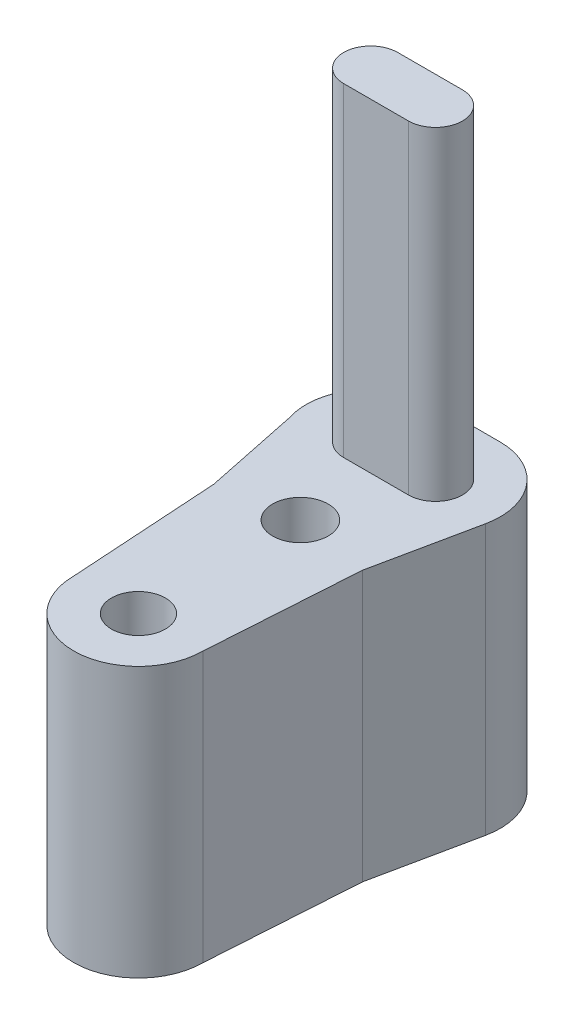
ISO-10303-21;
HEADER;
FILE_DESCRIPTION(('STEP AP214'),'2;1');
FILE_NAME('part.step','',(''),(''),'','','');
FILE_SCHEMA(('AUTOMOTIVE_DESIGN { 1 0 10303 214 1 1 1 1 }'));
ENDSEC;
DATA;
#1=APPLICATION_CONTEXT('core data for automotive mechanical design processes');
#2=APPLICATION_PROTOCOL_DEFINITION('international standard','automotive_design',2000,#1);
#3=PRODUCT_CONTEXT('',#1,'mechanical');
#4=PRODUCT('Part','Part','',(#3));
#5=PRODUCT_RELATED_PRODUCT_CATEGORY('part','',(#4));
#6=PRODUCT_DEFINITION_FORMATION('','',#4);
#7=PRODUCT_DEFINITION_CONTEXT('part definition',#1,'design');
#8=PRODUCT_DEFINITION('design','',#6,#7);
#9=PRODUCT_DEFINITION_SHAPE('','',#8);
#10=(LENGTH_UNIT() NAMED_UNIT(*) SI_UNIT(.MILLI.,.METRE.));
#11=(NAMED_UNIT(*) PLANE_ANGLE_UNIT() SI_UNIT($,.RADIAN.));
#12=(NAMED_UNIT(*) SI_UNIT($,.STERADIAN.) SOLID_ANGLE_UNIT());
#13=UNCERTAINTY_MEASURE_WITH_UNIT(LENGTH_MEASURE(1.E-05),#10,'distance_accuracy_value','');
#14=(GEOMETRIC_REPRESENTATION_CONTEXT(3) GLOBAL_UNCERTAINTY_ASSIGNED_CONTEXT((#13)) GLOBAL_UNIT_ASSIGNED_CONTEXT((#10,
#11,#12)) REPRESENTATION_CONTEXT('',''));
#15=CARTESIAN_POINT('',(0.,0.,0.));
#16=DIRECTION('',(0.,0.,1.));
#17=DIRECTION('',(1.,0.,0.));
#18=AXIS2_PLACEMENT_3D('',#15,#16,#17);
#19=CARTESIAN_POINT('',(0.,-7.41660919471891,-1.40263632888684));
#20=DIRECTION('',(0.,0.,1.));
#21=DIRECTION('',(1.,0.,0.));
#22=AXIS2_PLACEMENT_3D('',#19,#20,#21);
#23=PLANE('',#22);
#24=DIRECTION('',(1.,0.,0.));
#25=VECTOR('',#24,1.);
#26=CARTESIAN_POINT('',(-0.6,0.,-1.40263632888684));
#27=LINE('',#26,#25);
#28=CARTESIAN_POINT('',(-0.6,0.,-1.40263632888684));
#29=VERTEX_POINT('',#28);
#30=CARTESIAN_POINT('',(0.6,0.,-1.40263632888684));
#31=VERTEX_POINT('',#30);
#32=EDGE_CURVE('E138',#29,#31,#27,.T.);
#33=ORIENTED_EDGE('',*,*,#32,.T.);
#34=DIRECTION('',(0.,1.,0.));
#35=VECTOR('',#34,1.);
#36=CARTESIAN_POINT('',(0.6,-7.41660919471891,-1.40263632888684));
#37=LINE('',#36,#35);
#38=CARTESIAN_POINT('',(0.6,6.,-1.40263632888684));
#39=VERTEX_POINT('',#38);
#40=EDGE_CURVE('E40',#31,#39,#37,.T.);
#41=ORIENTED_EDGE('',*,*,#40,.T.);
#42=DIRECTION('',(1.,0.,0.));
#43=VECTOR('',#42,1.);
#44=CARTESIAN_POINT('',(0.,6.,-1.40263632888684));
#45=LINE('',#44,#43);
#46=CARTESIAN_POINT('',(-0.6,6.,-1.40263632888684));
#47=VERTEX_POINT('',#46);
#48=EDGE_CURVE('E208',#47,#39,#45,.T.);
#49=ORIENTED_EDGE('',*,*,#48,.F.);
#50=DIRECTION('',(0.,1.,0.));
#51=VECTOR('',#50,1.);
#52=CARTESIAN_POINT('',(-0.6,-7.41660919471891,-1.40263632888684));
#53=LINE('',#52,#51);
#54=EDGE_CURVE('E11',#29,#47,#53,.T.);
#55=ORIENTED_EDGE('',*,*,#54,.F.);
#56=EDGE_LOOP('',(#33,#41,#49,#55));
#57=FACE_BOUND('',#56,.T.);
#58=ADVANCED_FACE('F37',(#57),#23,.T.);
#59=CARTESIAN_POINT('',(-0.6,-7.41660919471891,-1.90263632888684));
#60=DIRECTION('',(0.,1.,0.));
#61=DIRECTION('',(0.,0.,1.));
#62=AXIS2_PLACEMENT_3D('',#59,#60,#61);
#63=CYLINDRICAL_SURFACE('',#62,0.5);
#64=CARTESIAN_POINT('',(-0.6,0.,-1.90263632888684));
#65=DIRECTION('',(0.,1.,0.));
#66=DIRECTION('',(0.,0.,1.));
#67=AXIS2_PLACEMENT_3D('',#64,#65,#66);
#68=CIRCLE('',#67,0.5);
#69=CARTESIAN_POINT('',(-0.6,0.,-2.40263632888684));
#70=VERTEX_POINT('',#69);
#71=EDGE_CURVE('E52',#70,#29,#68,.T.);
#72=ORIENTED_EDGE('',*,*,#71,.T.);
#73=ORIENTED_EDGE('',*,*,#54,.T.);
#74=CARTESIAN_POINT('',(-0.6,6.,-1.90263632888684));
#75=DIRECTION('',(0.,1.,0.));
#76=DIRECTION('',(0.,0.,1.));
#77=AXIS2_PLACEMENT_3D('',#74,#75,#76);
#78=CIRCLE('',#77,0.5);
#79=CARTESIAN_POINT('',(-0.6,6.,-2.40263632888684));
#80=VERTEX_POINT('',#79);
#81=EDGE_CURVE('E136',#80,#47,#78,.T.);
#82=ORIENTED_EDGE('',*,*,#81,.F.);
#83=DIRECTION('',(0.,1.,0.));
#84=VECTOR('',#83,1.);
#85=CARTESIAN_POINT('',(-0.6,-7.41660919471891,-2.40263632888684));
#86=LINE('',#85,#84);
#87=EDGE_CURVE('E45',#70,#80,#86,.T.);
#88=ORIENTED_EDGE('',*,*,#87,.F.);
#89=EDGE_LOOP('',(#72,#73,#82,#88));
#90=FACE_BOUND('',#89,.T.);
#91=ADVANCED_FACE('F235',(#90),#63,.T.);
#92=CARTESIAN_POINT('',(0.,-7.41660919471891,-2.40263632888684));
#93=DIRECTION('',(0.,0.,1.));
#94=DIRECTION('',(1.,0.,0.));
#95=AXIS2_PLACEMENT_3D('',#92,#93,#94);
#96=PLANE('',#95);
#97=DIRECTION('',(0.,1.,0.));
#98=VECTOR('',#97,1.);
#99=CARTESIAN_POINT('',(0.6,-7.41660919471891,-2.40263632888684));
#100=LINE('',#99,#98);
#101=CARTESIAN_POINT('',(0.6,0.,-2.40263632888684));
#102=VERTEX_POINT('',#101);
#103=CARTESIAN_POINT('',(0.6,6.,-2.40263632888684));
#104=VERTEX_POINT('',#103);
#105=EDGE_CURVE('E135',#102,#104,#100,.T.);
#106=ORIENTED_EDGE('',*,*,#105,.F.);
#107=DIRECTION('',(1.,0.,0.));
#108=VECTOR('',#107,1.);
#109=CARTESIAN_POINT('',(-0.6,0.,-2.40263632888684));
#110=LINE('',#109,#108);
#111=EDGE_CURVE('E60',#70,#102,#110,.T.);
#112=ORIENTED_EDGE('',*,*,#111,.F.);
#113=ORIENTED_EDGE('',*,*,#87,.T.);
#114=DIRECTION('',(1.,0.,0.));
#115=VECTOR('',#114,1.);
#116=CARTESIAN_POINT('',(0.,6.,-2.40263632888684));
#117=LINE('',#116,#115);
#118=EDGE_CURVE('E225',#80,#104,#117,.T.);
#119=ORIENTED_EDGE('',*,*,#118,.T.);
#120=EDGE_LOOP('',(#106,#112,#113,#119));
#121=FACE_BOUND('',#120,.T.);
#122=ADVANCED_FACE('F233',(#121),#96,.F.);
#123=CARTESIAN_POINT('',(0.6,-7.41660919471891,-1.90263632888684));
#124=DIRECTION('',(0.,1.,0.));
#125=DIRECTION('',(0.,0.,1.));
#126=AXIS2_PLACEMENT_3D('',#123,#124,#125);
#127=CYLINDRICAL_SURFACE('',#126,0.5);
#128=CARTESIAN_POINT('',(0.6,0.,-1.90263632888684));
#129=DIRECTION('',(0.,1.,0.));
#130=DIRECTION('',(0.,0.,1.));
#131=AXIS2_PLACEMENT_3D('',#128,#129,#130);
#132=CIRCLE('',#131,0.5);
#133=EDGE_CURVE('E129',#31,#102,#132,.T.);
#134=ORIENTED_EDGE('',*,*,#133,.T.);
#135=ORIENTED_EDGE('',*,*,#105,.T.);
#136=CARTESIAN_POINT('',(0.6,6.,-1.90263632888684));
#137=DIRECTION('',(0.,1.,0.));
#138=DIRECTION('',(0.,0.,1.));
#139=AXIS2_PLACEMENT_3D('',#136,#137,#138);
#140=CIRCLE('',#139,0.5);
#141=EDGE_CURVE('E131',#39,#104,#140,.T.);
#142=ORIENTED_EDGE('',*,*,#141,.F.);
#143=ORIENTED_EDGE('',*,*,#40,.F.);
#144=EDGE_LOOP('',(#134,#135,#142,#143));
#145=FACE_BOUND('',#144,.T.);
#146=ADVANCED_FACE('F127',(#145),#127,.T.);
#147=CARTESIAN_POINT('',(0.,6.,0.));
#148=DIRECTION('',(0.,1.,0.));
#149=DIRECTION('',(0.,0.,1.));
#150=AXIS2_PLACEMENT_3D('',#147,#148,#149);
#151=PLANE('',#150);
#152=ORIENTED_EDGE('',*,*,#48,.T.);
#153=ORIENTED_EDGE('',*,*,#141,.T.);
#154=ORIENTED_EDGE('',*,*,#118,.F.);
#155=ORIENTED_EDGE('',*,*,#81,.T.);
#156=EDGE_LOOP('',(#152,#153,#154,#155));
#157=FACE_BOUND('',#156,.T.);
#158=ADVANCED_FACE('F232',(#157),#151,.T.);
#159=CARTESIAN_POINT('',(0.,0.,0.));
#160=DIRECTION('',(0.,1.,0.));
#161=DIRECTION('',(0.,0.,1.));
#162=AXIS2_PLACEMENT_3D('',#159,#160,#161);
#163=PLANE('',#162);
#164=CARTESIAN_POINT('',(0.,0.,0.));
#165=DIRECTION('',(0.,1.,0.));
#166=DIRECTION('',(0.,0.,1.));
#167=AXIS2_PLACEMENT_3D('',#164,#165,#166);
#168=CIRCLE('',#167,0.515);
#169=CARTESIAN_POINT('',(0.,0.,0.515));
#170=VERTEX_POINT('',#169);
#171=EDGE_CURVE('E146',#170,#170,#168,.T.);
#172=ORIENTED_EDGE('',*,*,#171,.F.);
#173=EDGE_LOOP('',(#172));
#174=FACE_BOUND('',#173,.T.);
#175=CARTESIAN_POINT('',(0.,0.,3.));
#176=DIRECTION('',(0.,1.,0.));
#177=DIRECTION('',(0.,0.,1.));
#178=AXIS2_PLACEMENT_3D('',#175,#176,#177);
#179=CIRCLE('',#178,0.5);
#180=CARTESIAN_POINT('',(0.,0.,3.5));
#181=VERTEX_POINT('',#180);
#182=EDGE_CURVE('E180',#181,#181,#179,.T.);
#183=ORIENTED_EDGE('',*,*,#182,.F.);
#184=EDGE_LOOP('',(#183));
#185=FACE_BOUND('',#184,.T.);
#186=DIRECTION('',(0.204542628075845,0.,-0.978857657322977));
#187=VECTOR('',#186,1.);
#188=CARTESIAN_POINT('',(1.36858431225209,0.,0.285980121703282));
#189=LINE('',#188,#187);
#190=CARTESIAN_POINT('',(1.38030801958608,0.,0.229875236359576));
#191=VERTEX_POINT('',#190);
#192=CARTESIAN_POINT('',(1.77462918878757,0.,-1.65718517519583));
#193=VERTEX_POINT('',#192);
#194=EDGE_CURVE('E183',#191,#193,#189,.T.);
#195=ORIENTED_EDGE('',*,*,#194,.T.);
#196=CARTESIAN_POINT('',(0.6,0.,-1.90263632888684));
#197=DIRECTION('',(0.,1.,0.));
#198=DIRECTION('',(0.,0.,1.));
#199=AXIS2_PLACEMENT_3D('',#196,#197,#198);
#200=CIRCLE('',#199,1.2);
#201=CARTESIAN_POINT('',(0.6,0.,-3.10263632888684));
#202=VERTEX_POINT('',#201);
#203=EDGE_CURVE('E186',#193,#202,#200,.T.);
#204=ORIENTED_EDGE('',*,*,#203,.T.);
#205=DIRECTION('',(-1.,0.,0.));
#206=VECTOR('',#205,1.);
#207=CARTESIAN_POINT('',(0.,0.,-3.10263632888684));
#208=LINE('',#207,#206);
#209=CARTESIAN_POINT('',(-0.600000000000004,0.,-3.10263632888684));
#210=VERTEX_POINT('',#209);
#211=EDGE_CURVE('E189',#202,#210,#208,.T.);
#212=ORIENTED_EDGE('',*,*,#211,.T.);
#213=CARTESIAN_POINT('',(-0.6,0.,-1.90263632888684));
#214=DIRECTION('',(0.,1.,0.));
#215=DIRECTION('',(0.,0.,1.));
#216=AXIS2_PLACEMENT_3D('',#213,#214,#215);
#217=CIRCLE('',#216,1.2);
#218=CARTESIAN_POINT('',(-1.74043002516995,0.,-1.52924731232252));
#219=VERTEX_POINT('',#218);
#220=EDGE_CURVE('E192',#210,#219,#217,.T.);
#221=ORIENTED_EDGE('',*,*,#220,.T.);
#222=DIRECTION('',(-0.202915079921645,0.,-0.979196339015007));
#223=VECTOR('',#222,1.);
#224=CARTESIAN_POINT('',(-1.36491682559323,0.,0.282846448374439));
#225=LINE('',#224,#223);
#226=CARTESIAN_POINT('',(-1.37607705510717,0.,0.228991131722565));
#227=VERTEX_POINT('',#226);
#228=EDGE_CURVE('E195',#227,#219,#225,.T.);
#229=ORIENTED_EDGE('',*,*,#228,.F.);
#230=DIRECTION('',(-0.0634146863815828,0.,-0.997987263220892));
#231=VECTOR('',#230,1.);
#232=CARTESIAN_POINT('',(-1.38503544099125,0.,0.0880087265185839));
#233=LINE('',#232,#231);
#234=CARTESIAN_POINT('',(-1.2,0.,3.));
#235=VERTEX_POINT('',#234);
#236=EDGE_CURVE('E198',#235,#227,#233,.T.);
#237=ORIENTED_EDGE('',*,*,#236,.F.);
#238=CARTESIAN_POINT('',(0.,0.,3.));
#239=DIRECTION('',(0.,1.,0.));
#240=DIRECTION('',(0.,0.,1.));
#241=AXIS2_PLACEMENT_3D('',#238,#239,#240);
#242=CIRCLE('',#241,1.2);
#243=CARTESIAN_POINT('',(1.2,0.,3.));
#244=VERTEX_POINT('',#243);
#245=EDGE_CURVE('E201',#235,#244,#242,.T.);
#246=ORIENTED_EDGE('',*,*,#245,.T.);
#247=DIRECTION('',(0.0649527676919876,0.,-0.997888339429393));
#248=VECTOR('',#247,1.);
#249=CARTESIAN_POINT('',(1.38938419404348,0.,0.0904353174847487));
#250=LINE('',#249,#248);
#251=EDGE_CURVE('E151',#244,#191,#250,.T.);
#252=ORIENTED_EDGE('',*,*,#251,.T.);
#253=EDGE_LOOP('',(#195,#204,#212,#221,#229,#237,#246,#252));
#254=FACE_BOUND('',#253,.T.);
#255=ORIENTED_EDGE('',*,*,#71,.F.);
#256=ORIENTED_EDGE('',*,*,#111,.T.);
#257=ORIENTED_EDGE('',*,*,#133,.F.);
#258=ORIENTED_EDGE('',*,*,#32,.F.);
#259=EDGE_LOOP('',(#255,#256,#257,#258));
#260=FACE_BOUND('',#259,.T.);
#261=ADVANCED_FACE('F141',(#174,#185,#254,#260),#163,.T.);
#262=CARTESIAN_POINT('',(1.36858431225209,-5.,0.285980121703282));
#263=DIRECTION('',(0.978857657322977,0.,0.204542628075845));
#264=DIRECTION('',(0.204542628075845,0.,-0.978857657322977));
#265=AXIS2_PLACEMENT_3D('',#262,#263,#264);
#266=PLANE('',#265);
#267=ORIENTED_EDGE('',*,*,#194,.F.);
#268=DIRECTION('',(0.,1.,0.));
#269=VECTOR('',#268,1.);
#270=CARTESIAN_POINT('',(1.38030801958608,-5.,0.229875236359576));
#271=LINE('',#270,#269);
#272=CARTESIAN_POINT('',(1.38030801958608,-5.,0.229875236359576));
#273=VERTEX_POINT('',#272);
#274=EDGE_CURVE('E206',#273,#191,#271,.T.);
#275=ORIENTED_EDGE('',*,*,#274,.F.);
#276=DIRECTION('',(0.204542628075845,0.,-0.978857657322977));
#277=VECTOR('',#276,1.);
#278=CARTESIAN_POINT('',(1.36858431225209,-5.,0.285980121703282));
#279=LINE('',#278,#277);
#280=CARTESIAN_POINT('',(1.77462918878757,-5.,-1.65718517519583));
#281=VERTEX_POINT('',#280);
#282=EDGE_CURVE('E154',#273,#281,#279,.T.);
#283=ORIENTED_EDGE('',*,*,#282,.T.);
#284=DIRECTION('',(0.,1.,0.));
#285=VECTOR('',#284,1.);
#286=CARTESIAN_POINT('',(1.77462918878757,-5.,-1.65718517519583));
#287=LINE('',#286,#285);
#288=EDGE_CURVE('E177',#281,#193,#287,.T.);
#289=ORIENTED_EDGE('',*,*,#288,.T.);
#290=EDGE_LOOP('',(#267,#275,#283,#289));
#291=FACE_BOUND('',#290,.T.);
#292=ADVANCED_FACE('F253',(#291),#266,.T.);
#293=CARTESIAN_POINT('',(1.38938419404348,-5.,0.0904353174847487));
#294=DIRECTION('',(0.997888339429393,0.,0.0649527676919876));
#295=DIRECTION('',(0.0649527676919876,0.,-0.997888339429393));
#296=AXIS2_PLACEMENT_3D('',#293,#294,#295);
#297=PLANE('',#296);
#298=ORIENTED_EDGE('',*,*,#251,.F.);
#299=DIRECTION('',(0.,1.,0.));
#300=VECTOR('',#299,1.);
#301=CARTESIAN_POINT('',(1.2,-5.,3.));
#302=LINE('',#301,#300);
#303=CARTESIAN_POINT('',(1.2,-5.,3.));
#304=VERTEX_POINT('',#303);
#305=EDGE_CURVE('E209',#304,#244,#302,.T.);
#306=ORIENTED_EDGE('',*,*,#305,.F.);
#307=DIRECTION('',(0.0649527676919876,0.,-0.997888339429393));
#308=VECTOR('',#307,1.);
#309=CARTESIAN_POINT('',(1.38938419404348,-5.,0.0904353174847487));
#310=LINE('',#309,#308);
#311=EDGE_CURVE('E174',#304,#273,#310,.T.);
#312=ORIENTED_EDGE('',*,*,#311,.T.);
#313=ORIENTED_EDGE('',*,*,#274,.T.);
#314=EDGE_LOOP('',(#298,#306,#312,#313));
#315=FACE_BOUND('',#314,.T.);
#316=ADVANCED_FACE('F269',(#315),#297,.T.);
#317=CARTESIAN_POINT('',(0.,-5.,3.));
#318=DIRECTION('',(0.,1.,0.));
#319=DIRECTION('',(0.,0.,1.));
#320=AXIS2_PLACEMENT_3D('',#317,#318,#319);
#321=CYLINDRICAL_SURFACE('',#320,1.2);
#322=ORIENTED_EDGE('',*,*,#245,.F.);
#323=DIRECTION('',(0.,1.,0.));
#324=VECTOR('',#323,1.);
#325=CARTESIAN_POINT('',(-1.2,-5.,3.));
#326=LINE('',#325,#324);
#327=CARTESIAN_POINT('',(-1.2,-5.,3.));
#328=VERTEX_POINT('',#327);
#329=EDGE_CURVE('E211',#328,#235,#326,.T.);
#330=ORIENTED_EDGE('',*,*,#329,.F.);
#331=CARTESIAN_POINT('',(0.,-5.,3.));
#332=DIRECTION('',(0.,1.,0.));
#333=DIRECTION('',(0.,0.,1.));
#334=AXIS2_PLACEMENT_3D('',#331,#332,#333);
#335=CIRCLE('',#334,1.2);
#336=EDGE_CURVE('E171',#328,#304,#335,.T.);
#337=ORIENTED_EDGE('',*,*,#336,.T.);
#338=ORIENTED_EDGE('',*,*,#305,.T.);
#339=EDGE_LOOP('',(#322,#330,#337,#338));
#340=FACE_BOUND('',#339,.T.);
#341=ADVANCED_FACE('F288',(#340),#321,.T.);
#342=CARTESIAN_POINT('',(-1.38503544099125,-5.,0.0880087265185839));
#343=DIRECTION('',(0.997987263220892,0.,-0.0634146863815828));
#344=DIRECTION('',(-0.0634146863815828,0.,-0.997987263220892));
#345=AXIS2_PLACEMENT_3D('',#342,#343,#344);
#346=PLANE('',#345);
#347=ORIENTED_EDGE('',*,*,#236,.T.);
#348=DIRECTION('',(0.,1.,0.));
#349=VECTOR('',#348,1.);
#350=CARTESIAN_POINT('',(-1.37607705510717,-5.,0.228991131722565));
#351=LINE('',#350,#349);
#352=CARTESIAN_POINT('',(-1.37607705510717,-5.,0.228991131722565));
#353=VERTEX_POINT('',#352);
#354=EDGE_CURVE('E213',#353,#227,#351,.T.);
#355=ORIENTED_EDGE('',*,*,#354,.F.);
#356=DIRECTION('',(-0.0634146863815828,0.,-0.997987263220892));
#357=VECTOR('',#356,1.);
#358=CARTESIAN_POINT('',(-1.38503544099125,-5.,0.0880087265185839));
#359=LINE('',#358,#357);
#360=EDGE_CURVE('E168',#328,#353,#359,.T.);
#361=ORIENTED_EDGE('',*,*,#360,.F.);
#362=ORIENTED_EDGE('',*,*,#329,.T.);
#363=EDGE_LOOP('',(#347,#355,#361,#362));
#364=FACE_BOUND('',#363,.T.);
#365=ADVANCED_FACE('F284',(#364),#346,.F.);
#366=CARTESIAN_POINT('',(-1.36491682559323,-5.,0.282846448374439));
#367=DIRECTION('',(0.979196339015007,0.,-0.202915079921645));
#368=DIRECTION('',(-0.202915079921645,0.,-0.979196339015007));
#369=AXIS2_PLACEMENT_3D('',#366,#367,#368);
#370=PLANE('',#369);
#371=ORIENTED_EDGE('',*,*,#228,.T.);
#372=DIRECTION('',(0.,1.,0.));
#373=VECTOR('',#372,1.);
#374=CARTESIAN_POINT('',(-1.74043002516995,-5.,-1.52924731232252));
#375=LINE('',#374,#373);
#376=CARTESIAN_POINT('',(-1.74043002516995,-5.,-1.52924731232252));
#377=VERTEX_POINT('',#376);
#378=EDGE_CURVE('E216',#377,#219,#375,.T.);
#379=ORIENTED_EDGE('',*,*,#378,.F.);
#380=DIRECTION('',(-0.202915079921645,0.,-0.979196339015007));
#381=VECTOR('',#380,1.);
#382=CARTESIAN_POINT('',(-1.36491682559323,-5.,0.282846448374439));
#383=LINE('',#382,#381);
#384=EDGE_CURVE('E166',#353,#377,#383,.T.);
#385=ORIENTED_EDGE('',*,*,#384,.F.);
#386=ORIENTED_EDGE('',*,*,#354,.T.);
#387=EDGE_LOOP('',(#371,#379,#385,#386));
#388=FACE_BOUND('',#387,.T.);
#389=ADVANCED_FACE('F280',(#388),#370,.F.);
#390=CARTESIAN_POINT('',(-0.6,-5.,-1.90263632888684));
#391=DIRECTION('',(0.,1.,0.));
#392=DIRECTION('',(0.,0.,1.));
#393=AXIS2_PLACEMENT_3D('',#390,#391,#392);
#394=CYLINDRICAL_SURFACE('',#393,1.2);
#395=ORIENTED_EDGE('',*,*,#220,.F.);
#396=DIRECTION('',(0.,1.,0.));
#397=VECTOR('',#396,1.);
#398=CARTESIAN_POINT('',(-0.600000000000004,-5.,-3.10263632888684));
#399=LINE('',#398,#397);
#400=CARTESIAN_POINT('',(-0.600000000000004,-5.,-3.10263632888684));
#401=VERTEX_POINT('',#400);
#402=EDGE_CURVE('E218',#401,#210,#399,.T.);
#403=ORIENTED_EDGE('',*,*,#402,.F.);
#404=CARTESIAN_POINT('',(-0.6,-5.,-1.90263632888684));
#405=DIRECTION('',(0.,1.,0.));
#406=DIRECTION('',(0.,0.,1.));
#407=AXIS2_PLACEMENT_3D('',#404,#405,#406);
#408=CIRCLE('',#407,1.2);
#409=EDGE_CURVE('E163',#401,#377,#408,.T.);
#410=ORIENTED_EDGE('',*,*,#409,.T.);
#411=ORIENTED_EDGE('',*,*,#378,.T.);
#412=EDGE_LOOP('',(#395,#403,#410,#411));
#413=FACE_BOUND('',#412,.T.);
#414=ADVANCED_FACE('F276',(#413),#394,.T.);
#415=CARTESIAN_POINT('',(0.,-5.,-3.10263632888684));
#416=DIRECTION('',(0.,0.,-1.));
#417=DIRECTION('',(-1.,0.,0.));
#418=AXIS2_PLACEMENT_3D('',#415,#416,#417);
#419=PLANE('',#418);
#420=ORIENTED_EDGE('',*,*,#211,.F.);
#421=DIRECTION('',(0.,1.,0.));
#422=VECTOR('',#421,1.);
#423=CARTESIAN_POINT('',(0.6,-5.,-3.10263632888684));
#424=LINE('',#423,#422);
#425=CARTESIAN_POINT('',(0.6,-5.,-3.10263632888684));
#426=VERTEX_POINT('',#425);
#427=EDGE_CURVE('E220',#426,#202,#424,.T.);
#428=ORIENTED_EDGE('',*,*,#427,.F.);
#429=DIRECTION('',(-1.,0.,0.));
#430=VECTOR('',#429,1.);
#431=CARTESIAN_POINT('',(0.,-5.,-3.10263632888684));
#432=LINE('',#431,#430);
#433=EDGE_CURVE('E160',#426,#401,#432,.T.);
#434=ORIENTED_EDGE('',*,*,#433,.T.);
#435=ORIENTED_EDGE('',*,*,#402,.T.);
#436=EDGE_LOOP('',(#420,#428,#434,#435));
#437=FACE_BOUND('',#436,.T.);
#438=ADVANCED_FACE('F265',(#437),#419,.T.);
#439=CARTESIAN_POINT('',(0.,-5.,3.));
#440=DIRECTION('',(0.,1.,0.));
#441=DIRECTION('',(0.,0.,1.));
#442=AXIS2_PLACEMENT_3D('',#439,#440,#441);
#443=CYLINDRICAL_SURFACE('',#442,0.5);
#444=CARTESIAN_POINT('',(0.,-5.,3.));
#445=DIRECTION('',(0.,1.,0.));
#446=DIRECTION('',(0.,0.,1.));
#447=AXIS2_PLACEMENT_3D('',#444,#445,#446);
#448=CIRCLE('',#447,0.5);
#449=CARTESIAN_POINT('',(0.,-5.,3.5));
#450=VERTEX_POINT('',#449);
#451=EDGE_CURVE('E150',#450,#450,#448,.T.);
#452=ORIENTED_EDGE('',*,*,#451,.F.);
#453=EDGE_LOOP('',(#452));
#454=FACE_BOUND('',#453,.T.);
#455=ORIENTED_EDGE('',*,*,#182,.T.);
#456=EDGE_LOOP('',(#455));
#457=FACE_BOUND('',#456,.T.);
#458=ADVANCED_FACE('F261',(#454,#457),#443,.F.);
#459=CARTESIAN_POINT('',(0.,-5.,0.));
#460=DIRECTION('',(0.,1.,0.));
#461=DIRECTION('',(0.,0.,1.));
#462=AXIS2_PLACEMENT_3D('',#459,#460,#461);
#463=CYLINDRICAL_SURFACE('',#462,0.515);
#464=CARTESIAN_POINT('',(0.,-5.,0.));
#465=DIRECTION('',(0.,1.,0.));
#466=DIRECTION('',(0.,0.,1.));
#467=AXIS2_PLACEMENT_3D('',#464,#465,#466);
#468=CIRCLE('',#467,0.515);
#469=CARTESIAN_POINT('',(0.,-5.,0.515));
#470=VERTEX_POINT('',#469);
#471=EDGE_CURVE('E147',#470,#470,#468,.T.);
#472=ORIENTED_EDGE('',*,*,#471,.F.);
#473=EDGE_LOOP('',(#472));
#474=FACE_BOUND('',#473,.T.);
#475=ORIENTED_EDGE('',*,*,#171,.T.);
#476=EDGE_LOOP('',(#475));
#477=FACE_BOUND('',#476,.T.);
#478=ADVANCED_FACE('F257',(#474,#477),#463,.F.);
#479=CARTESIAN_POINT('',(0.6,-5.,-1.90263632888684));
#480=DIRECTION('',(0.,1.,0.));
#481=DIRECTION('',(0.,0.,1.));
#482=AXIS2_PLACEMENT_3D('',#479,#480,#481);
#483=CYLINDRICAL_SURFACE('',#482,1.2);
#484=ORIENTED_EDGE('',*,*,#203,.F.);
#485=ORIENTED_EDGE('',*,*,#288,.F.);
#486=CARTESIAN_POINT('',(0.6,-5.,-1.90263632888684));
#487=DIRECTION('',(0.,1.,0.));
#488=DIRECTION('',(0.,0.,1.));
#489=AXIS2_PLACEMENT_3D('',#486,#487,#488);
#490=CIRCLE('',#489,1.2);
#491=EDGE_CURVE('E157',#281,#426,#490,.T.);
#492=ORIENTED_EDGE('',*,*,#491,.T.);
#493=ORIENTED_EDGE('',*,*,#427,.T.);
#494=EDGE_LOOP('',(#484,#485,#492,#493));
#495=FACE_BOUND('',#494,.T.);
#496=ADVANCED_FACE('F260',(#495),#483,.T.);
#497=CARTESIAN_POINT('',(0.,-5.,0.));
#498=DIRECTION('',(0.,1.,0.));
#499=DIRECTION('',(0.,0.,1.));
#500=AXIS2_PLACEMENT_3D('',#497,#498,#499);
#501=PLANE('',#500);
#502=ORIENTED_EDGE('',*,*,#282,.F.);
#503=ORIENTED_EDGE('',*,*,#311,.F.);
#504=ORIENTED_EDGE('',*,*,#336,.F.);
#505=ORIENTED_EDGE('',*,*,#360,.T.);
#506=ORIENTED_EDGE('',*,*,#384,.T.);
#507=ORIENTED_EDGE('',*,*,#409,.F.);
#508=ORIENTED_EDGE('',*,*,#433,.F.);
#509=ORIENTED_EDGE('',*,*,#491,.F.);
#510=EDGE_LOOP('',(#502,#503,#504,#505,#506,#507,#508,#509));
#511=FACE_BOUND('',#510,.T.);
#512=ORIENTED_EDGE('',*,*,#451,.T.);
#513=EDGE_LOOP('',(#512));
#514=FACE_BOUND('',#513,.T.);
#515=ORIENTED_EDGE('',*,*,#471,.T.);
#516=EDGE_LOOP('',(#515));
#517=FACE_BOUND('',#516,.T.);
#518=ADVANCED_FACE('F244',(#511,#514,#517),#501,.F.);
#519=CLOSED_SHELL('',(#58,#91,#122,#146,#158,#261,#292,#316,#341,#365,#389,#414,#438,#458,#478,
#496,#518));
#520=MANIFOLD_SOLID_BREP('B2',#519);
#521=ADVANCED_BREP_SHAPE_REPRESENTATION('',(#18,#520),#14);
#522=SHAPE_DEFINITION_REPRESENTATION(#9,#521);
ENDSEC;
END-ISO-10303-21;
